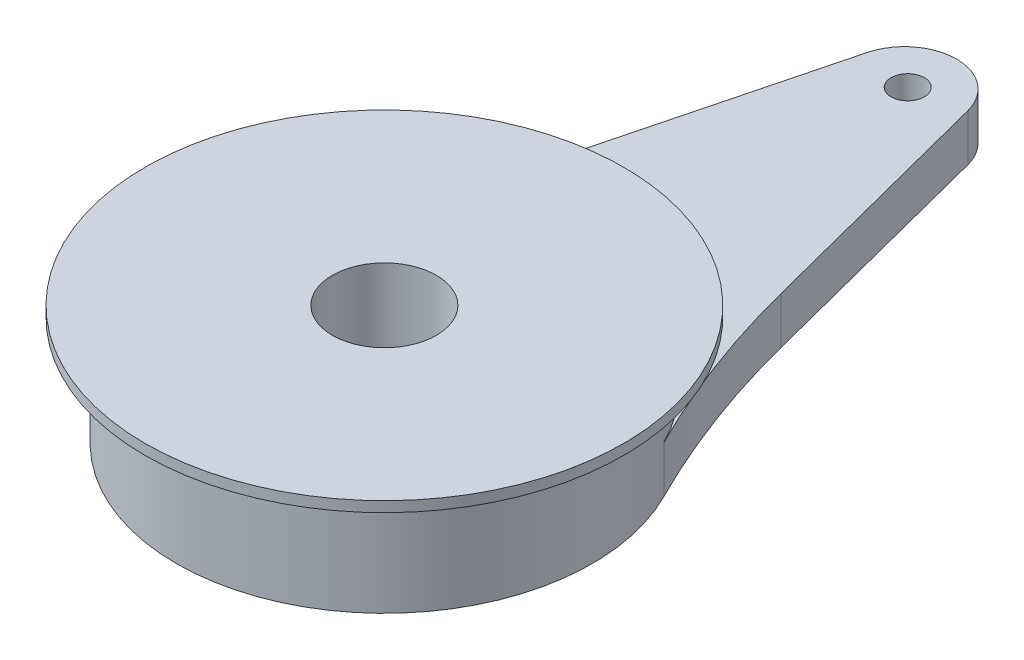
ISO-10303-21;
HEADER;
FILE_DESCRIPTION(('STEP AP214'),'2;1');
FILE_NAME('part.step','',(''),(''),'','','');
FILE_SCHEMA(('AUTOMOTIVE_DESIGN { 1 0 10303 214 1 1 1 1 }'));
ENDSEC;
DATA;
#1=APPLICATION_CONTEXT('core data for automotive mechanical design processes');
#2=APPLICATION_PROTOCOL_DEFINITION('international standard','automotive_design',2000,#1);
#3=PRODUCT_CONTEXT('',#1,'mechanical');
#4=PRODUCT('Part','Part','',(#3));
#5=PRODUCT_RELATED_PRODUCT_CATEGORY('part','',(#4));
#6=PRODUCT_DEFINITION_FORMATION('','',#4);
#7=PRODUCT_DEFINITION_CONTEXT('part definition',#1,'design');
#8=PRODUCT_DEFINITION('design','',#6,#7);
#9=PRODUCT_DEFINITION_SHAPE('','',#8);
#10=(LENGTH_UNIT() NAMED_UNIT(*) SI_UNIT(.MILLI.,.METRE.));
#11=(NAMED_UNIT(*) PLANE_ANGLE_UNIT() SI_UNIT($,.RADIAN.));
#12=(NAMED_UNIT(*) SI_UNIT($,.STERADIAN.) SOLID_ANGLE_UNIT());
#13=UNCERTAINTY_MEASURE_WITH_UNIT(LENGTH_MEASURE(1.E-05),#10,'distance_accuracy_value','');
#14=(GEOMETRIC_REPRESENTATION_CONTEXT(3) GLOBAL_UNCERTAINTY_ASSIGNED_CONTEXT((#13)) GLOBAL_UNIT_ASSIGNED_CONTEXT((#10,
#11,#12)) REPRESENTATION_CONTEXT('',''));
#15=CARTESIAN_POINT('',(0.,0.,0.));
#16=DIRECTION('',(0.,0.,1.));
#17=DIRECTION('',(1.,0.,0.));
#18=AXIS2_PLACEMENT_3D('',#15,#16,#17);
#19=CARTESIAN_POINT('',(0.,4.5,0.));
#20=DIRECTION('',(0.,1.,0.));
#21=DIRECTION('',(0.,0.,1.));
#22=AXIS2_PLACEMENT_3D('',#19,#20,#21);
#23=PLANE('',#22);
#24=CARTESIAN_POINT('',(0.,4.5,-50.3054222761264));
#25=DIRECTION('',(0.,1.,0.));
#26=DIRECTION('',(0.,0.,1.));
#27=AXIS2_PLACEMENT_3D('',#24,#25,#26);
#28=CIRCLE('',#27,1.6);
#29=CARTESIAN_POINT('',(0.,4.5,-48.7054222761264));
#30=VERTEX_POINT('',#29);
#31=EDGE_CURVE('E124',#30,#30,#28,.T.);
#32=ORIENTED_EDGE('',*,*,#31,.F.);
#33=EDGE_LOOP('',(#32));
#34=FACE_BOUND('',#33,.T.);
#35=CARTESIAN_POINT('',(-98.2331410472046,4.5,-49.5));
#36=DIRECTION('',(0.,1.,0.));
#37=DIRECTION('',(0.,0.,1.));
#38=AXIS2_PLACEMENT_3D('',#35,#36,#37);
#39=CIRCLE('',#38,90.);
#40=CARTESIAN_POINT('',(-11.0809798084897,4.5,-27.0389049371803));
#41=VERTEX_POINT('',#40);
#42=CARTESIAN_POINT('',(-17.8605710994918,4.5,-9.00000000000001));
#43=VERTEX_POINT('',#42);
#44=EDGE_CURVE('E55',#41,#43,#39,.F.);
#45=ORIENTED_EDGE('',*,*,#44,.T.);
#46=CARTESIAN_POINT('',(0.,4.5,0.));
#47=DIRECTION('',(0.,1.,0.));
#48=DIRECTION('',(0.,0.,1.));
#49=AXIS2_PLACEMENT_3D('',#46,#47,#48);
#50=CIRCLE('',#49,20.);
#51=CARTESIAN_POINT('',(17.8605710994918,4.5,-9.00000000000001));
#52=VERTEX_POINT('',#51);
#53=EDGE_CURVE('E149',#43,#52,#50,.F.);
#54=ORIENTED_EDGE('',*,*,#53,.T.);
#55=CARTESIAN_POINT('',(98.2331410472046,4.5,-49.5));
#56=DIRECTION('',(0.,1.,0.));
#57=DIRECTION('',(0.,0.,1.));
#58=AXIS2_PLACEMENT_3D('',#55,#56,#57);
#59=CIRCLE('',#58,90.);
#60=CARTESIAN_POINT('',(11.0809798084897,4.5,-27.0389049371803));
#61=VERTEX_POINT('',#60);
#62=EDGE_CURVE('E133',#61,#52,#59,.T.);
#63=ORIENTED_EDGE('',*,*,#62,.F.);
#64=DIRECTION('',(0.24956772292022,0.,0.968357347096833));
#65=VECTOR('',#64,1.);
#66=CARTESIAN_POINT('',(16.9253236398852,4.5,-4.36204103078028));
#67=LINE('',#66,#65);
#68=CARTESIAN_POINT('',(4.84178673548417,4.5,-51.2478386146011));
#69=VERTEX_POINT('',#68);
#70=EDGE_CURVE('E113',#69,#61,#67,.T.);
#71=ORIENTED_EDGE('',*,*,#70,.F.);
#72=CARTESIAN_POINT('',(0.,4.5,-50.));
#73=DIRECTION('',(0.,1.,0.));
#74=DIRECTION('',(0.,0.,1.));
#75=AXIS2_PLACEMENT_3D('',#72,#73,#74);
#76=CIRCLE('',#75,5.);
#77=CARTESIAN_POINT('',(-4.84178673548417,4.5,-51.2478386146011));
#78=VERTEX_POINT('',#77);
#79=EDGE_CURVE('E101',#78,#69,#76,.F.);
#80=ORIENTED_EDGE('',*,*,#79,.F.);
#81=DIRECTION('',(0.24956772292022,0.,-0.968357347096833));
#82=VECTOR('',#81,1.);
#83=CARTESIAN_POINT('',(-16.9253236398852,4.5,-4.36204103078028));
#84=LINE('',#83,#82);
#85=EDGE_CURVE('E111',#41,#78,#84,.T.);
#86=ORIENTED_EDGE('',*,*,#85,.F.);
#87=EDGE_LOOP('',(#45,#54,#63,#71,#80,#86));
#88=FACE_BOUND('',#87,.T.);
#89=ADVANCED_FACE('F37',(#34,#88),#23,.T.);
#90=CARTESIAN_POINT('',(98.2331410472046,4.5,-49.5));
#91=DIRECTION('',(0.,-1.,0.));
#92=DIRECTION('',(0.,0.,-1.));
#93=AXIS2_PLACEMENT_3D('',#90,#91,#92);
#94=CYLINDRICAL_SURFACE('',#93,90.);
#95=CARTESIAN_POINT('',(98.2331410472046,0.,-49.5));
#96=DIRECTION('',(0.,1.,0.));
#97=DIRECTION('',(0.,0.,1.));
#98=AXIS2_PLACEMENT_3D('',#95,#96,#97);
#99=CIRCLE('',#98,90.);
#100=CARTESIAN_POINT('',(11.0809798084897,0.,-27.0389049371803));
#101=VERTEX_POINT('',#100);
#102=CARTESIAN_POINT('',(17.8605710994918,0.,-9.00000000000001));
#103=VERTEX_POINT('',#102);
#104=EDGE_CURVE('E120',#101,#103,#99,.T.);
#105=ORIENTED_EDGE('',*,*,#104,.F.);
#106=DIRECTION('',(0.,-1.,0.));
#107=VECTOR('',#106,1.);
#108=CARTESIAN_POINT('',(11.0809798084897,4.5,-27.0389049371803));
#109=LINE('',#108,#107);
#110=EDGE_CURVE('E11',#61,#101,#109,.T.);
#111=ORIENTED_EDGE('',*,*,#110,.F.);
#112=ORIENTED_EDGE('',*,*,#62,.T.);
#113=DIRECTION('',(0.,-1.,0.));
#114=VECTOR('',#113,1.);
#115=CARTESIAN_POINT('',(17.8605710994918,4.5,-9.00000000000001));
#116=LINE('',#115,#114);
#117=EDGE_CURVE('E85',#52,#103,#116,.T.);
#118=ORIENTED_EDGE('',*,*,#117,.T.);
#119=EDGE_LOOP('',(#105,#111,#112,#118));
#120=FACE_BOUND('',#119,.T.);
#121=ADVANCED_FACE('F39',(#120),#94,.F.);
#122=CARTESIAN_POINT('',(16.9253236398852,4.5,-4.36204103078028));
#123=DIRECTION('',(0.968357347096833,0.,-0.24956772292022));
#124=DIRECTION('',(-0.24956772292022,0.,-0.968357347096833));
#125=AXIS2_PLACEMENT_3D('',#122,#123,#124);
#126=PLANE('',#125);
#127=DIRECTION('',(0.24956772292022,0.,0.968357347096833));
#128=VECTOR('',#127,1.);
#129=CARTESIAN_POINT('',(16.9253236398852,0.,-4.36204103078028));
#130=LINE('',#129,#128);
#131=CARTESIAN_POINT('',(4.84178673548417,0.,-51.2478386146011));
#132=VERTEX_POINT('',#131);
#133=EDGE_CURVE('E123',#132,#101,#130,.T.);
#134=ORIENTED_EDGE('',*,*,#133,.F.);
#135=DIRECTION('',(0.,-1.,0.));
#136=VECTOR('',#135,1.);
#137=CARTESIAN_POINT('',(4.84178673548417,4.5,-51.2478386146011));
#138=LINE('',#137,#136);
#139=EDGE_CURVE('E47',#69,#132,#138,.T.);
#140=ORIENTED_EDGE('',*,*,#139,.F.);
#141=ORIENTED_EDGE('',*,*,#70,.T.);
#142=ORIENTED_EDGE('',*,*,#110,.T.);
#143=EDGE_LOOP('',(#134,#140,#141,#142));
#144=FACE_BOUND('',#143,.T.);
#145=ADVANCED_FACE('F140',(#144),#126,.T.);
#146=CARTESIAN_POINT('',(0.,4.5,-50.));
#147=DIRECTION('',(0.,-1.,0.));
#148=DIRECTION('',(0.,0.,-1.));
#149=AXIS2_PLACEMENT_3D('',#146,#147,#148);
#150=CYLINDRICAL_SURFACE('',#149,5.);
#151=CARTESIAN_POINT('',(0.,0.,-50.));
#152=DIRECTION('',(0.,1.,0.));
#153=DIRECTION('',(0.,0.,1.));
#154=AXIS2_PLACEMENT_3D('',#151,#152,#153);
#155=CIRCLE('',#154,5.);
#156=CARTESIAN_POINT('',(-4.84178673548417,0.,-51.2478386146011));
#157=VERTEX_POINT('',#156);
#158=EDGE_CURVE('E103',#157,#132,#155,.F.);
#159=ORIENTED_EDGE('',*,*,#158,.F.);
#160=DIRECTION('',(0.,-1.,0.));
#161=VECTOR('',#160,1.);
#162=CARTESIAN_POINT('',(-4.84178673548417,4.5,-51.2478386146011));
#163=LINE('',#162,#161);
#164=EDGE_CURVE('E98',#78,#157,#163,.T.);
#165=ORIENTED_EDGE('',*,*,#164,.F.);
#166=ORIENTED_EDGE('',*,*,#79,.T.);
#167=ORIENTED_EDGE('',*,*,#139,.T.);
#168=EDGE_LOOP('',(#159,#165,#166,#167));
#169=FACE_BOUND('',#168,.T.);
#170=ADVANCED_FACE('F100',(#169),#150,.T.);
#171=CARTESIAN_POINT('',(-16.9253236398852,4.5,-4.36204103078028));
#172=DIRECTION('',(-0.968357347096833,0.,-0.24956772292022));
#173=DIRECTION('',(-0.24956772292022,0.,0.968357347096833));
#174=AXIS2_PLACEMENT_3D('',#171,#172,#173);
#175=PLANE('',#174);
#176=DIRECTION('',(0.24956772292022,0.,-0.968357347096833));
#177=VECTOR('',#176,1.);
#178=CARTESIAN_POINT('',(-16.9253236398852,0.,-4.36204103078028));
#179=LINE('',#178,#177);
#180=CARTESIAN_POINT('',(-11.0809798084897,0.,-27.0389049371803));
#181=VERTEX_POINT('',#180);
#182=EDGE_CURVE('E128',#181,#157,#179,.T.);
#183=ORIENTED_EDGE('',*,*,#182,.F.);
#184=DIRECTION('',(0.,-1.,0.));
#185=VECTOR('',#184,1.);
#186=CARTESIAN_POINT('',(-11.0809798084897,4.5,-27.0389049371803));
#187=LINE('',#186,#185);
#188=EDGE_CURVE('E108',#41,#181,#187,.T.);
#189=ORIENTED_EDGE('',*,*,#188,.F.);
#190=ORIENTED_EDGE('',*,*,#85,.T.);
#191=ORIENTED_EDGE('',*,*,#164,.T.);
#192=EDGE_LOOP('',(#183,#189,#190,#191));
#193=FACE_BOUND('',#192,.T.);
#194=ADVANCED_FACE('F115',(#193),#175,.T.);
#195=CARTESIAN_POINT('',(-98.2331410472046,4.5,-49.5));
#196=DIRECTION('',(0.,-1.,0.));
#197=DIRECTION('',(0.,0.,-1.));
#198=AXIS2_PLACEMENT_3D('',#195,#196,#197);
#199=CYLINDRICAL_SURFACE('',#198,90.);
#200=CARTESIAN_POINT('',(-98.2331410472046,0.,-49.5));
#201=DIRECTION('',(0.,1.,0.));
#202=DIRECTION('',(0.,0.,1.));
#203=AXIS2_PLACEMENT_3D('',#200,#201,#202);
#204=CIRCLE('',#203,90.);
#205=CARTESIAN_POINT('',(-17.8605710994918,0.,-9.00000000000001));
#206=VERTEX_POINT('',#205);
#207=EDGE_CURVE('E77',#181,#206,#204,.F.);
#208=ORIENTED_EDGE('',*,*,#207,.T.);
#209=DIRECTION('',(0.,-1.,0.));
#210=VECTOR('',#209,1.);
#211=CARTESIAN_POINT('',(-17.8605710994918,4.5,-9.00000000000001));
#212=LINE('',#211,#210);
#213=EDGE_CURVE('E135',#43,#206,#212,.T.);
#214=ORIENTED_EDGE('',*,*,#213,.F.);
#215=ORIENTED_EDGE('',*,*,#44,.F.);
#216=ORIENTED_EDGE('',*,*,#188,.T.);
#217=EDGE_LOOP('',(#208,#214,#215,#216));
#218=FACE_BOUND('',#217,.T.);
#219=ADVANCED_FACE('F150',(#218),#199,.F.);
#220=CARTESIAN_POINT('',(0.,4.5,0.));
#221=DIRECTION('',(0.,-1.,0.));
#222=DIRECTION('',(0.,0.,-1.));
#223=AXIS2_PLACEMENT_3D('',#220,#221,#222);
#224=CYLINDRICAL_SURFACE('',#223,20.);
#225=CARTESIAN_POINT('',(0.,0.,0.));
#226=DIRECTION('',(0.,1.,0.));
#227=DIRECTION('',(0.,0.,1.));
#228=AXIS2_PLACEMENT_3D('',#225,#226,#227);
#229=CIRCLE('',#228,20.);
#230=EDGE_CURVE('E131',#206,#103,#229,.T.);
#231=ORIENTED_EDGE('',*,*,#230,.T.);
#232=ORIENTED_EDGE('',*,*,#117,.F.);
#233=ORIENTED_EDGE('',*,*,#53,.F.);
#234=ORIENTED_EDGE('',*,*,#213,.T.);
#235=EDGE_LOOP('',(#231,#232,#233,#234));
#236=FACE_BOUND('',#235,.T.);
#237=CARTESIAN_POINT('',(0.,10.5,0.));
#238=DIRECTION('',(0.,1.,0.));
#239=DIRECTION('',(0.,0.,1.));
#240=AXIS2_PLACEMENT_3D('',#237,#238,#239);
#241=CIRCLE('',#240,20.);
#242=CARTESIAN_POINT('',(0.,10.5,20.));
#243=VERTEX_POINT('',#242);
#244=EDGE_CURVE('E196',#243,#243,#241,.T.);
#245=ORIENTED_EDGE('',*,*,#244,.F.);
#246=EDGE_LOOP('',(#245));
#247=FACE_BOUND('',#246,.T.);
#248=ADVANCED_FACE('F146',(#236,#247),#224,.T.);
#249=CARTESIAN_POINT('',(0.,4.5,0.));
#250=DIRECTION('',(0.,-1.,0.));
#251=DIRECTION('',(0.,0.,-1.));
#252=AXIS2_PLACEMENT_3D('',#249,#250,#251);
#253=CYLINDRICAL_SURFACE('',#252,5.);
#254=CARTESIAN_POINT('',(0.,4.,0.));
#255=DIRECTION('',(0.,1.,0.));
#256=DIRECTION('',(0.,0.,1.));
#257=AXIS2_PLACEMENT_3D('',#254,#255,#256);
#258=CIRCLE('',#257,5.);
#259=CARTESIAN_POINT('',(0.,4.,5.));
#260=VERTEX_POINT('',#259);
#261=EDGE_CURVE('E41',#260,#260,#258,.T.);
#262=ORIENTED_EDGE('',*,*,#261,.F.);
#263=EDGE_LOOP('',(#262));
#264=FACE_BOUND('',#263,.T.);
#265=CARTESIAN_POINT('',(0.,11.5,0.));
#266=DIRECTION('',(0.,1.,0.));
#267=DIRECTION('',(0.,0.,1.));
#268=AXIS2_PLACEMENT_3D('',#265,#266,#267);
#269=CIRCLE('',#268,5.);
#270=CARTESIAN_POINT('',(0.,11.5,5.));
#271=VERTEX_POINT('',#270);
#272=EDGE_CURVE('E183',#271,#271,#269,.T.);
#273=ORIENTED_EDGE('',*,*,#272,.T.);
#274=EDGE_LOOP('',(#273));
#275=FACE_BOUND('',#274,.T.);
#276=ADVANCED_FACE('F157',(#264,#275),#253,.F.);
#277=CARTESIAN_POINT('',(0.,0.,0.));
#278=DIRECTION('',(0.,1.,0.));
#279=DIRECTION('',(0.,0.,1.));
#280=AXIS2_PLACEMENT_3D('',#277,#278,#279);
#281=PLANE('',#280);
#282=CARTESIAN_POINT('',(0.,0.,0.));
#283=DIRECTION('',(0.,1.,0.));
#284=DIRECTION('',(0.,0.,1.));
#285=AXIS2_PLACEMENT_3D('',#282,#283,#284);
#286=CIRCLE('',#285,13.);
#287=CARTESIAN_POINT('',(0.,0.,13.));
#288=VERTEX_POINT('',#287);
#289=EDGE_CURVE('E193',#288,#288,#286,.T.);
#290=ORIENTED_EDGE('',*,*,#289,.T.);
#291=EDGE_LOOP('',(#290));
#292=FACE_BOUND('',#291,.T.);
#293=ORIENTED_EDGE('',*,*,#230,.F.);
#294=ORIENTED_EDGE('',*,*,#207,.F.);
#295=ORIENTED_EDGE('',*,*,#182,.T.);
#296=ORIENTED_EDGE('',*,*,#158,.T.);
#297=ORIENTED_EDGE('',*,*,#133,.T.);
#298=ORIENTED_EDGE('',*,*,#104,.T.);
#299=EDGE_LOOP('',(#293,#294,#295,#296,#297,#298));
#300=FACE_BOUND('',#299,.T.);
#301=CARTESIAN_POINT('',(0.,0.,-50.3054222761264));
#302=DIRECTION('',(0.,1.,0.));
#303=DIRECTION('',(0.,0.,1.));
#304=AXIS2_PLACEMENT_3D('',#301,#302,#303);
#305=CIRCLE('',#304,1.6);
#306=CARTESIAN_POINT('',(0.,0.,-48.7054222761264));
#307=VERTEX_POINT('',#306);
#308=EDGE_CURVE('E201',#307,#307,#305,.T.);
#309=ORIENTED_EDGE('',*,*,#308,.T.);
#310=EDGE_LOOP('',(#309));
#311=FACE_BOUND('',#310,.T.);
#312=ADVANCED_FACE('F143',(#292,#300,#311),#281,.F.);
#313=CARTESIAN_POINT('',(0.,4.501,-50.3054222761264));
#314=DIRECTION('',(0.,-1.,0.));
#315=DIRECTION('',(0.,0.,-1.));
#316=AXIS2_PLACEMENT_3D('',#313,#314,#315);
#317=CYLINDRICAL_SURFACE('',#316,1.6);
#318=ORIENTED_EDGE('',*,*,#31,.T.);
#319=EDGE_LOOP('',(#318));
#320=FACE_BOUND('',#319,.T.);
#321=ORIENTED_EDGE('',*,*,#308,.F.);
#322=EDGE_LOOP('',(#321));
#323=FACE_BOUND('',#322,.T.);
#324=ADVANCED_FACE('F169',(#320,#323),#317,.F.);
#325=CARTESIAN_POINT('',(0.,11.5,0.));
#326=DIRECTION('',(0.,1.,0.));
#327=DIRECTION('',(0.,0.,1.));
#328=AXIS2_PLACEMENT_3D('',#325,#326,#327);
#329=PLANE('',#328);
#330=CARTESIAN_POINT('',(0.,11.5,0.));
#331=DIRECTION('',(0.,1.,0.));
#332=DIRECTION('',(0.,0.,1.));
#333=AXIS2_PLACEMENT_3D('',#330,#331,#332);
#334=CIRCLE('',#333,23.);
#335=CARTESIAN_POINT('',(0.,11.5,23.));
#336=VERTEX_POINT('',#335);
#337=EDGE_CURVE('E188',#336,#336,#334,.T.);
#338=ORIENTED_EDGE('',*,*,#337,.T.);
#339=EDGE_LOOP('',(#338));
#340=FACE_BOUND('',#339,.T.);
#341=ORIENTED_EDGE('',*,*,#272,.F.);
#342=EDGE_LOOP('',(#341));
#343=FACE_BOUND('',#342,.T.);
#344=ADVANCED_FACE('F209',(#340,#343),#329,.T.);
#345=CARTESIAN_POINT('',(0.,10.5,0.));
#346=DIRECTION('',(0.,1.,0.));
#347=DIRECTION('',(0.,0.,1.));
#348=AXIS2_PLACEMENT_3D('',#345,#346,#347);
#349=PLANE('',#348);
#350=ORIENTED_EDGE('',*,*,#244,.T.);
#351=EDGE_LOOP('',(#350));
#352=FACE_BOUND('',#351,.T.);
#353=CARTESIAN_POINT('',(0.,10.5,0.));
#354=DIRECTION('',(0.,1.,0.));
#355=DIRECTION('',(0.,0.,1.));
#356=AXIS2_PLACEMENT_3D('',#353,#354,#355);
#357=CIRCLE('',#356,23.);
#358=CARTESIAN_POINT('',(0.,10.5,23.));
#359=VERTEX_POINT('',#358);
#360=EDGE_CURVE('E185',#359,#359,#357,.T.);
#361=ORIENTED_EDGE('',*,*,#360,.F.);
#362=EDGE_LOOP('',(#361));
#363=FACE_BOUND('',#362,.T.);
#364=ADVANCED_FACE('F214',(#352,#363),#349,.F.);
#365=CARTESIAN_POINT('',(0.,11.5,0.));
#366=DIRECTION('',(0.,-1.,0.));
#367=DIRECTION('',(0.,0.,-1.));
#368=AXIS2_PLACEMENT_3D('',#365,#366,#367);
#369=CYLINDRICAL_SURFACE('',#368,23.);
#370=ORIENTED_EDGE('',*,*,#337,.F.);
#371=EDGE_LOOP('',(#370));
#372=FACE_BOUND('',#371,.T.);
#373=ORIENTED_EDGE('',*,*,#360,.T.);
#374=EDGE_LOOP('',(#373));
#375=FACE_BOUND('',#374,.T.);
#376=ADVANCED_FACE('F220',(#372,#375),#369,.T.);
#377=CARTESIAN_POINT('',(0.,4.,0.));
#378=DIRECTION('',(0.,-1.,0.));
#379=DIRECTION('',(0.,0.,-1.));
#380=AXIS2_PLACEMENT_3D('',#377,#378,#379);
#381=CYLINDRICAL_SURFACE('',#380,13.);
#382=CARTESIAN_POINT('',(0.,4.,0.));
#383=DIRECTION('',(0.,1.,0.));
#384=DIRECTION('',(0.,0.,1.));
#385=AXIS2_PLACEMENT_3D('',#382,#383,#384);
#386=CIRCLE('',#385,13.);
#387=CARTESIAN_POINT('',(0.,4.,13.));
#388=VERTEX_POINT('',#387);
#389=EDGE_CURVE('E190',#388,#388,#386,.T.);
#390=ORIENTED_EDGE('',*,*,#389,.T.);
#391=EDGE_LOOP('',(#390));
#392=FACE_BOUND('',#391,.T.);
#393=ORIENTED_EDGE('',*,*,#289,.F.);
#394=EDGE_LOOP('',(#393));
#395=FACE_BOUND('',#394,.T.);
#396=ADVANCED_FACE('F224',(#392,#395),#381,.F.);
#397=CARTESIAN_POINT('',(0.,4.,0.));
#398=DIRECTION('',(0.,1.,0.));
#399=DIRECTION('',(0.,0.,1.));
#400=AXIS2_PLACEMENT_3D('',#397,#398,#399);
#401=PLANE('',#400);
#402=ORIENTED_EDGE('',*,*,#261,.T.);
#403=EDGE_LOOP('',(#402));
#404=FACE_BOUND('',#403,.T.);
#405=ORIENTED_EDGE('',*,*,#389,.F.);
#406=EDGE_LOOP('',(#405));
#407=FACE_BOUND('',#406,.T.);
#408=ADVANCED_FACE('F231',(#404,#407),#401,.F.);
#409=CLOSED_SHELL('',(#89,#121,#145,#170,#194,#219,#248,#276,#312,#324,#344,#364,#376,#396,#408));
#410=MANIFOLD_SOLID_BREP('B2',#409);
#411=ADVANCED_BREP_SHAPE_REPRESENTATION('',(#18,#410),#14);
#412=SHAPE_DEFINITION_REPRESENTATION(#9,#411);
ENDSEC;
END-ISO-10303-21;
